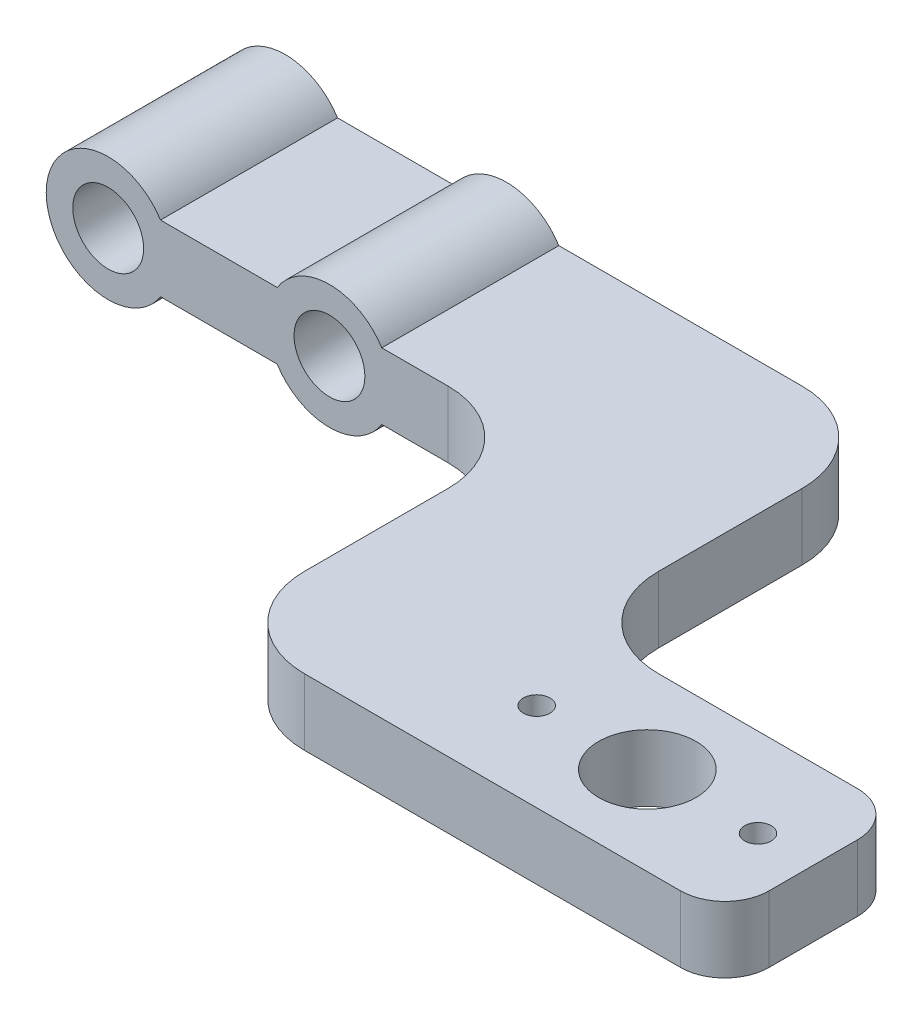
ISO-10303-21;
HEADER;
FILE_DESCRIPTION(('STEP AP214'),'2;1');
FILE_NAME('part.step','',(''),(''),'','','');
FILE_SCHEMA(('AUTOMOTIVE_DESIGN { 1 0 10303 214 1 1 1 1 }'));
ENDSEC;
DATA;
#1=APPLICATION_CONTEXT('core data for automotive mechanical design processes');
#2=APPLICATION_PROTOCOL_DEFINITION('international standard','automotive_design',2000,#1);
#3=PRODUCT_CONTEXT('',#1,'mechanical');
#4=PRODUCT('Part','Part','',(#3));
#5=PRODUCT_RELATED_PRODUCT_CATEGORY('part','',(#4));
#6=PRODUCT_DEFINITION_FORMATION('','',#4);
#7=PRODUCT_DEFINITION_CONTEXT('part definition',#1,'design');
#8=PRODUCT_DEFINITION('design','',#6,#7);
#9=PRODUCT_DEFINITION_SHAPE('','',#8);
#10=(LENGTH_UNIT() NAMED_UNIT(*) SI_UNIT(.MILLI.,.METRE.));
#11=(NAMED_UNIT(*) PLANE_ANGLE_UNIT() SI_UNIT($,.RADIAN.));
#12=(NAMED_UNIT(*) SI_UNIT($,.STERADIAN.) SOLID_ANGLE_UNIT());
#13=UNCERTAINTY_MEASURE_WITH_UNIT(LENGTH_MEASURE(1.E-05),#10,'distance_accuracy_value','');
#14=(GEOMETRIC_REPRESENTATION_CONTEXT(3) GLOBAL_UNCERTAINTY_ASSIGNED_CONTEXT((#13)) GLOBAL_UNIT_ASSIGNED_CONTEXT((#10,
#11,#12)) REPRESENTATION_CONTEXT('',''));
#15=CARTESIAN_POINT('',(0.,0.,0.));
#16=DIRECTION('',(0.,0.,1.));
#17=DIRECTION('',(1.,0.,0.));
#18=AXIS2_PLACEMENT_3D('',#15,#16,#17);
#19=CARTESIAN_POINT('',(-34.8643180835074,1.5,-18.5));
#20=DIRECTION('',(0.,0.,1.));
#21=DIRECTION('',(1.,0.,0.));
#22=AXIS2_PLACEMENT_3D('',#19,#20,#21);
#23=CYLINDRICAL_SURFACE('',#22,2.8);
#24=CARTESIAN_POINT('',(-34.8643180835074,1.5,-10.5));
#25=DIRECTION('',(0.,0.,-1.));
#26=DIRECTION('',(-1.,0.,0.));
#27=AXIS2_PLACEMENT_3D('',#24,#25,#26);
#28=CIRCLE('',#27,2.8);
#29=CARTESIAN_POINT('',(-32.5,2.99999999999999,-10.5));
#30=VERTEX_POINT('',#29);
#31=CARTESIAN_POINT('',(-32.5,0.,-10.5));
#32=VERTEX_POINT('',#31);
#33=EDGE_CURVE('E394',#30,#32,#28,.F.);
#34=ORIENTED_EDGE('',*,*,#33,.F.);
#35=DIRECTION('',(0.,0.,1.));
#36=VECTOR('',#35,1.);
#37=CARTESIAN_POINT('',(-32.5,2.99999999999999,-18.5));
#38=LINE('',#37,#36);
#39=CARTESIAN_POINT('',(-32.5,2.99999999999999,-18.5));
#40=VERTEX_POINT('',#39);
#41=EDGE_CURVE('E187',#40,#30,#38,.T.);
#42=ORIENTED_EDGE('',*,*,#41,.F.);
#43=CARTESIAN_POINT('',(-34.8643180835074,1.5,-18.5));
#44=DIRECTION('',(0.,0.,1.));
#45=DIRECTION('',(1.,0.,0.));
#46=AXIS2_PLACEMENT_3D('',#43,#44,#45);
#47=CIRCLE('',#46,2.8);
#48=CARTESIAN_POINT('',(-32.5,0.,-18.5));
#49=VERTEX_POINT('',#48);
#50=EDGE_CURVE('E353',#40,#49,#47,.T.);
#51=ORIENTED_EDGE('',*,*,#50,.T.);
#52=DIRECTION('',(0.,0.,1.));
#53=VECTOR('',#52,1.);
#54=CARTESIAN_POINT('',(-32.5,0.,-18.5));
#55=LINE('',#54,#53);
#56=EDGE_CURVE('E199',#49,#32,#55,.T.);
#57=ORIENTED_EDGE('',*,*,#56,.T.);
#58=EDGE_LOOP('',(#34,#42,#51,#57));
#59=FACE_BOUND('',#58,.T.);
#60=ADVANCED_FACE('F39',(#59),#23,.T.);
#61=CARTESIAN_POINT('',(0.,3.,0.));
#62=DIRECTION('',(0.,-1.,0.));
#63=DIRECTION('',(0.,0.,-1.));
#64=AXIS2_PLACEMENT_3D('',#61,#62,#63);
#65=PLANE('',#64);
#66=DIRECTION('',(0.,0.,1.));
#67=VECTOR('',#66,1.);
#68=CARTESIAN_POINT('',(-7.5,3.,-18.5));
#69=LINE('',#68,#67);
#70=CARTESIAN_POINT('',(-7.5,3.,-14.5));
#71=VERTEX_POINT('',#70);
#72=CARTESIAN_POINT('',(-7.5,3.,-8.));
#73=VERTEX_POINT('',#72);
#74=EDGE_CURVE('E201',#71,#73,#69,.T.);
#75=ORIENTED_EDGE('',*,*,#74,.F.);
#76=CARTESIAN_POINT('',(-11.5,3.,-14.5));
#77=DIRECTION('',(0.,-1.,0.));
#78=DIRECTION('',(0.,0.,-1.));
#79=AXIS2_PLACEMENT_3D('',#76,#77,#78);
#80=CIRCLE('',#79,4.);
#81=CARTESIAN_POINT('',(-11.5,3.,-18.5));
#82=VERTEX_POINT('',#81);
#83=EDGE_CURVE('E311',#71,#82,#80,.F.);
#84=ORIENTED_EDGE('',*,*,#83,.T.);
#85=DIRECTION('',(-1.,0.,0.));
#86=VECTOR('',#85,1.);
#87=CARTESIAN_POINT('',(-7.5,3.,-18.5));
#88=LINE('',#87,#86);
#89=CARTESIAN_POINT('',(-22.5,3.,-18.5));
#90=VERTEX_POINT('',#89);
#91=EDGE_CURVE('E361',#82,#90,#88,.T.);
#92=ORIENTED_EDGE('',*,*,#91,.T.);
#93=DIRECTION('',(0.,0.,1.));
#94=VECTOR('',#93,1.);
#95=CARTESIAN_POINT('',(-22.5,3.,-18.5));
#96=LINE('',#95,#94);
#97=CARTESIAN_POINT('',(-22.5,3.,-10.5));
#98=VERTEX_POINT('',#97);
#99=EDGE_CURVE('E195',#90,#98,#96,.T.);
#100=ORIENTED_EDGE('',*,*,#99,.T.);
#101=DIRECTION('',(1.,0.,0.));
#102=VECTOR('',#101,1.);
#103=CARTESIAN_POINT('',(0.,3.,-10.5));
#104=LINE('',#103,#102);
#105=CARTESIAN_POINT('',(-19.5,3.,-10.5));
#106=VERTEX_POINT('',#105);
#107=EDGE_CURVE('E174',#98,#106,#104,.T.);
#108=ORIENTED_EDGE('',*,*,#107,.T.);
#109=CARTESIAN_POINT('',(-19.5,3.,-6.5));
#110=DIRECTION('',(0.,-1.,0.));
#111=DIRECTION('',(0.,0.,-1.));
#112=AXIS2_PLACEMENT_3D('',#109,#110,#111);
#113=CIRCLE('',#112,4.);
#114=CARTESIAN_POINT('',(-15.5,3.,-6.5));
#115=VERTEX_POINT('',#114);
#116=EDGE_CURVE('E328',#106,#115,#113,.T.);
#117=ORIENTED_EDGE('',*,*,#116,.T.);
#118=DIRECTION('',(0.,0.,1.));
#119=VECTOR('',#118,1.);
#120=CARTESIAN_POINT('',(-15.5,3.,0.));
#121=LINE('',#120,#119);
#122=CARTESIAN_POINT('',(-15.5,3.,0.));
#123=VERTEX_POINT('',#122);
#124=EDGE_CURVE('E376',#115,#123,#121,.T.);
#125=ORIENTED_EDGE('',*,*,#124,.T.);
#126=CARTESIAN_POINT('',(-11.5,3.,0.));
#127=DIRECTION('',(0.,-1.,0.));
#128=DIRECTION('',(0.,0.,-1.));
#129=AXIS2_PLACEMENT_3D('',#126,#127,#128);
#130=CIRCLE('',#129,4.);
#131=CARTESIAN_POINT('',(-11.5,3.,4.));
#132=VERTEX_POINT('',#131);
#133=EDGE_CURVE('E308',#123,#132,#130,.F.);
#134=ORIENTED_EDGE('',*,*,#133,.T.);
#135=DIRECTION('',(1.,0.,0.));
#136=VECTOR('',#135,1.);
#137=CARTESIAN_POINT('',(-7.5,3.,4.));
#138=LINE('',#137,#136);
#139=CARTESIAN_POINT('',(5.5,3.,4.));
#140=VERTEX_POINT('',#139);
#141=EDGE_CURVE('E247',#132,#140,#138,.T.);
#142=ORIENTED_EDGE('',*,*,#141,.T.);
#143=CARTESIAN_POINT('',(5.5,3.,2.));
#144=DIRECTION('',(0.,-1.,0.));
#145=DIRECTION('',(0.,0.,-1.));
#146=AXIS2_PLACEMENT_3D('',#143,#144,#145);
#147=CIRCLE('',#146,2.);
#148=CARTESIAN_POINT('',(7.5,3.,2.));
#149=VERTEX_POINT('',#148);
#150=EDGE_CURVE('E276',#140,#149,#147,.F.);
#151=ORIENTED_EDGE('',*,*,#150,.T.);
#152=DIRECTION('',(0.,0.,-1.));
#153=VECTOR('',#152,1.);
#154=CARTESIAN_POINT('',(7.5,3.,4.));
#155=LINE('',#154,#153);
#156=CARTESIAN_POINT('',(7.5,3.,-2.));
#157=VERTEX_POINT('',#156);
#158=EDGE_CURVE('E238',#149,#157,#155,.T.);
#159=ORIENTED_EDGE('',*,*,#158,.T.);
#160=CARTESIAN_POINT('',(5.5,3.,-2.));
#161=DIRECTION('',(0.,-1.,0.));
#162=DIRECTION('',(0.,0.,-1.));
#163=AXIS2_PLACEMENT_3D('',#160,#161,#162);
#164=CIRCLE('',#163,2.);
#165=CARTESIAN_POINT('',(5.5,3.,-4.));
#166=VERTEX_POINT('',#165);
#167=EDGE_CURVE('E279',#157,#166,#164,.F.);
#168=ORIENTED_EDGE('',*,*,#167,.T.);
#169=DIRECTION('',(-1.,0.,0.));
#170=VECTOR('',#169,1.);
#171=CARTESIAN_POINT('',(-7.5,3.,-4.));
#172=LINE('',#171,#170);
#173=CARTESIAN_POINT('',(-3.5,3.,-4.));
#174=VERTEX_POINT('',#173);
#175=EDGE_CURVE('E242',#166,#174,#172,.T.);
#176=ORIENTED_EDGE('',*,*,#175,.T.);
#177=CARTESIAN_POINT('',(-3.5,3.,-8.));
#178=DIRECTION('',(0.,-1.,0.));
#179=DIRECTION('',(0.,0.,-1.));
#180=AXIS2_PLACEMENT_3D('',#177,#178,#179);
#181=CIRCLE('',#180,4.);
#182=EDGE_CURVE('E11',#174,#73,#181,.T.);
#183=ORIENTED_EDGE('',*,*,#182,.T.);
#184=EDGE_LOOP('',(#75,#84,#92,#100,#108,#117,#125,#134,#142,#151,#159,#168,#176,#183));
#185=FACE_BOUND('',#184,.T.);
#186=CARTESIAN_POINT('',(0.,3.,0.));
#187=DIRECTION('',(0.,1.,0.));
#188=DIRECTION('',(0.,0.,1.));
#189=AXIS2_PLACEMENT_3D('',#186,#187,#188);
#190=CIRCLE('',#189,2.2);
#191=CARTESIAN_POINT('',(0.,3.,2.2));
#192=VERTEX_POINT('',#191);
#193=EDGE_CURVE('E230',#192,#192,#190,.T.);
#194=ORIENTED_EDGE('',*,*,#193,.F.);
#195=EDGE_LOOP('',(#194));
#196=FACE_BOUND('',#195,.T.);
#197=CARTESIAN_POINT('',(-5.,3.,0.));
#198=DIRECTION('',(0.,1.,0.));
#199=DIRECTION('',(0.,0.,1.));
#200=AXIS2_PLACEMENT_3D('',#197,#198,#199);
#201=CIRCLE('',#200,0.6);
#202=CARTESIAN_POINT('',(-5.,3.,0.600000000000002));
#203=VERTEX_POINT('',#202);
#204=EDGE_CURVE('E222',#203,#203,#201,.T.);
#205=ORIENTED_EDGE('',*,*,#204,.F.);
#206=EDGE_LOOP('',(#205));
#207=FACE_BOUND('',#206,.T.);
#208=CARTESIAN_POINT('',(5.,3.,0.));
#209=DIRECTION('',(0.,1.,0.));
#210=DIRECTION('',(0.,0.,-1.));
#211=AXIS2_PLACEMENT_3D('',#208,#209,#210);
#212=CIRCLE('',#211,0.6);
#213=CARTESIAN_POINT('',(5.,3.,-0.599999999999998));
#214=VERTEX_POINT('',#213);
#215=EDGE_CURVE('E212',#214,#214,#212,.T.);
#216=ORIENTED_EDGE('',*,*,#215,.F.);
#217=EDGE_LOOP('',(#216));
#218=FACE_BOUND('',#217,.T.);
#219=ADVANCED_FACE('F421',(#185,#196,#207,#218),#65,.F.);
#220=CARTESIAN_POINT('',(0.,0.,0.));
#221=DIRECTION('',(0.,-1.,0.));
#222=DIRECTION('',(0.,0.,-1.));
#223=AXIS2_PLACEMENT_3D('',#220,#221,#222);
#224=PLANE('',#223);
#225=DIRECTION('',(1.,0.,0.));
#226=VECTOR('',#225,1.);
#227=CARTESIAN_POINT('',(-7.5,0.,-18.5));
#228=LINE('',#227,#226);
#229=CARTESIAN_POINT('',(-22.5,0.,-18.5));
#230=VERTEX_POINT('',#229);
#231=CARTESIAN_POINT('',(-11.5,0.,-18.5));
#232=VERTEX_POINT('',#231);
#233=EDGE_CURVE('E364',#230,#232,#228,.T.);
#234=ORIENTED_EDGE('',*,*,#233,.T.);
#235=CARTESIAN_POINT('',(-11.5,0.,-14.5));
#236=DIRECTION('',(0.,-1.,0.));
#237=DIRECTION('',(0.,0.,-1.));
#238=AXIS2_PLACEMENT_3D('',#235,#236,#237);
#239=CIRCLE('',#238,4.);
#240=CARTESIAN_POINT('',(-7.5,0.,-14.5));
#241=VERTEX_POINT('',#240);
#242=EDGE_CURVE('E320',#232,#241,#239,.T.);
#243=ORIENTED_EDGE('',*,*,#242,.T.);
#244=DIRECTION('',(0.,0.,1.));
#245=VECTOR('',#244,1.);
#246=CARTESIAN_POINT('',(-7.5,0.,-18.5));
#247=LINE('',#246,#245);
#248=CARTESIAN_POINT('',(-7.5,0.,-8.));
#249=VERTEX_POINT('',#248);
#250=EDGE_CURVE('E208',#241,#249,#247,.T.);
#251=ORIENTED_EDGE('',*,*,#250,.T.);
#252=CARTESIAN_POINT('',(-3.5,0.,-8.));
#253=DIRECTION('',(0.,-1.,0.));
#254=DIRECTION('',(0.,0.,-1.));
#255=AXIS2_PLACEMENT_3D('',#252,#253,#254);
#256=CIRCLE('',#255,4.);
#257=CARTESIAN_POINT('',(-3.5,0.,-4.));
#258=VERTEX_POINT('',#257);
#259=EDGE_CURVE('E48',#249,#258,#256,.F.);
#260=ORIENTED_EDGE('',*,*,#259,.T.);
#261=DIRECTION('',(-1.,0.,0.));
#262=VECTOR('',#261,1.);
#263=CARTESIAN_POINT('',(-7.5,0.,-4.));
#264=LINE('',#263,#262);
#265=CARTESIAN_POINT('',(5.5,0.,-4.));
#266=VERTEX_POINT('',#265);
#267=EDGE_CURVE('E254',#266,#258,#264,.T.);
#268=ORIENTED_EDGE('',*,*,#267,.F.);
#269=CARTESIAN_POINT('',(5.5,0.,-2.));
#270=DIRECTION('',(0.,-1.,0.));
#271=DIRECTION('',(0.,0.,-1.));
#272=AXIS2_PLACEMENT_3D('',#269,#270,#271);
#273=CIRCLE('',#272,2.);
#274=CARTESIAN_POINT('',(7.5,0.,-2.));
#275=VERTEX_POINT('',#274);
#276=EDGE_CURVE('E266',#266,#275,#273,.T.);
#277=ORIENTED_EDGE('',*,*,#276,.T.);
#278=DIRECTION('',(0.,0.,-1.));
#279=VECTOR('',#278,1.);
#280=CARTESIAN_POINT('',(7.5,0.,4.));
#281=LINE('',#280,#279);
#282=CARTESIAN_POINT('',(7.5,0.,2.));
#283=VERTEX_POINT('',#282);
#284=EDGE_CURVE('E234',#283,#275,#281,.T.);
#285=ORIENTED_EDGE('',*,*,#284,.F.);
#286=CARTESIAN_POINT('',(5.5,0.,2.));
#287=DIRECTION('',(0.,-1.,0.));
#288=DIRECTION('',(0.,0.,-1.));
#289=AXIS2_PLACEMENT_3D('',#286,#287,#288);
#290=CIRCLE('',#289,2.);
#291=CARTESIAN_POINT('',(5.5,0.,4.));
#292=VERTEX_POINT('',#291);
#293=EDGE_CURVE('E262',#283,#292,#290,.T.);
#294=ORIENTED_EDGE('',*,*,#293,.T.);
#295=DIRECTION('',(1.,0.,0.));
#296=VECTOR('',#295,1.);
#297=CARTESIAN_POINT('',(-7.5,0.,4.));
#298=LINE('',#297,#296);
#299=CARTESIAN_POINT('',(-11.5,0.,4.));
#300=VERTEX_POINT('',#299);
#301=EDGE_CURVE('E243',#300,#292,#298,.T.);
#302=ORIENTED_EDGE('',*,*,#301,.F.);
#303=CARTESIAN_POINT('',(-11.5,0.,0.));
#304=DIRECTION('',(0.,-1.,0.));
#305=DIRECTION('',(0.,0.,-1.));
#306=AXIS2_PLACEMENT_3D('',#303,#304,#305);
#307=CIRCLE('',#306,4.);
#308=CARTESIAN_POINT('',(-15.5,0.,0.));
#309=VERTEX_POINT('',#308);
#310=EDGE_CURVE('E317',#300,#309,#307,.T.);
#311=ORIENTED_EDGE('',*,*,#310,.T.);
#312=DIRECTION('',(0.,0.,1.));
#313=VECTOR('',#312,1.);
#314=CARTESIAN_POINT('',(-15.5,0.,0.));
#315=LINE('',#314,#313);
#316=CARTESIAN_POINT('',(-15.5,0.,-6.5));
#317=VERTEX_POINT('',#316);
#318=EDGE_CURVE('E380',#317,#309,#315,.T.);
#319=ORIENTED_EDGE('',*,*,#318,.F.);
#320=CARTESIAN_POINT('',(-19.5,0.,-6.5));
#321=DIRECTION('',(0.,-1.,0.));
#322=DIRECTION('',(0.,0.,-1.));
#323=AXIS2_PLACEMENT_3D('',#320,#321,#322);
#324=CIRCLE('',#323,4.);
#325=CARTESIAN_POINT('',(-19.5,0.,-10.5));
#326=VERTEX_POINT('',#325);
#327=EDGE_CURVE('E331',#317,#326,#324,.F.);
#328=ORIENTED_EDGE('',*,*,#327,.T.);
#329=DIRECTION('',(1.,0.,0.));
#330=VECTOR('',#329,1.);
#331=CARTESIAN_POINT('',(0.,0.,-10.5));
#332=LINE('',#331,#330);
#333=CARTESIAN_POINT('',(-22.5,0.,-10.5));
#334=VERTEX_POINT('',#333);
#335=EDGE_CURVE('E384',#334,#326,#332,.T.);
#336=ORIENTED_EDGE('',*,*,#335,.F.);
#337=DIRECTION('',(0.,0.,1.));
#338=VECTOR('',#337,1.);
#339=CARTESIAN_POINT('',(-22.5,0.,-18.5));
#340=LINE('',#339,#338);
#341=EDGE_CURVE('E221',#230,#334,#340,.T.);
#342=ORIENTED_EDGE('',*,*,#341,.F.);
#343=EDGE_LOOP('',(#234,#243,#251,#260,#268,#277,#285,#294,#302,#311,#319,#328,#336,#342));
#344=FACE_BOUND('',#343,.T.);
#345=CARTESIAN_POINT('',(-5.,0.,0.));
#346=DIRECTION('',(0.,1.,0.));
#347=DIRECTION('',(0.,0.,1.));
#348=AXIS2_PLACEMENT_3D('',#345,#346,#347);
#349=CIRCLE('',#348,0.6);
#350=CARTESIAN_POINT('',(-5.,0.,0.600000000000002));
#351=VERTEX_POINT('',#350);
#352=EDGE_CURVE('E216',#351,#351,#349,.T.);
#353=ORIENTED_EDGE('',*,*,#352,.T.);
#354=EDGE_LOOP('',(#353));
#355=FACE_BOUND('',#354,.T.);
#356=CARTESIAN_POINT('',(0.,0.,0.));
#357=DIRECTION('',(0.,1.,0.));
#358=DIRECTION('',(0.,0.,1.));
#359=AXIS2_PLACEMENT_3D('',#356,#357,#358);
#360=CIRCLE('',#359,2.2);
#361=CARTESIAN_POINT('',(0.,0.,2.2));
#362=VERTEX_POINT('',#361);
#363=EDGE_CURVE('E226',#362,#362,#360,.T.);
#364=ORIENTED_EDGE('',*,*,#363,.T.);
#365=EDGE_LOOP('',(#364));
#366=FACE_BOUND('',#365,.T.);
#367=CARTESIAN_POINT('',(5.,0.,0.));
#368=DIRECTION('',(0.,1.,0.));
#369=DIRECTION('',(0.,0.,-1.));
#370=AXIS2_PLACEMENT_3D('',#367,#368,#369);
#371=CIRCLE('',#370,0.6);
#372=CARTESIAN_POINT('',(5.,0.,-0.599999999999998));
#373=VERTEX_POINT('',#372);
#374=EDGE_CURVE('E217',#373,#373,#371,.T.);
#375=ORIENTED_EDGE('',*,*,#374,.T.);
#376=EDGE_LOOP('',(#375));
#377=FACE_BOUND('',#376,.T.);
#378=ADVANCED_FACE('F426',(#344,#355,#366,#377),#224,.T.);
#379=CARTESIAN_POINT('',(7.5,3.,4.));
#380=DIRECTION('',(-1.,0.,0.));
#381=DIRECTION('',(0.,0.,1.));
#382=AXIS2_PLACEMENT_3D('',#379,#380,#381);
#383=PLANE('',#382);
#384=ORIENTED_EDGE('',*,*,#284,.T.);
#385=DIRECTION('',(0.,-1.,0.));
#386=VECTOR('',#385,1.);
#387=CARTESIAN_POINT('',(7.5,3.,-2.));
#388=LINE('',#387,#386);
#389=EDGE_CURVE('E273',#275,#157,#388,.F.);
#390=ORIENTED_EDGE('',*,*,#389,.T.);
#391=ORIENTED_EDGE('',*,*,#158,.F.);
#392=DIRECTION('',(0.,-1.,0.));
#393=VECTOR('',#392,1.);
#394=CARTESIAN_POINT('',(7.5,3.,2.));
#395=LINE('',#394,#393);
#396=EDGE_CURVE('E269',#149,#283,#395,.T.);
#397=ORIENTED_EDGE('',*,*,#396,.T.);
#398=EDGE_LOOP('',(#384,#390,#391,#397));
#399=FACE_BOUND('',#398,.T.);
#400=ADVANCED_FACE('F458',(#399),#383,.F.);
#401=CARTESIAN_POINT('',(-7.5,3.,-4.));
#402=DIRECTION('',(0.,0.,1.));
#403=DIRECTION('',(1.,0.,0.));
#404=AXIS2_PLACEMENT_3D('',#401,#402,#403);
#405=PLANE('',#404);
#406=ORIENTED_EDGE('',*,*,#267,.T.);
#407=DIRECTION('',(0.,-1.,0.));
#408=VECTOR('',#407,1.);
#409=CARTESIAN_POINT('',(-3.5,3.,-4.));
#410=LINE('',#409,#408);
#411=EDGE_CURVE('E323',#258,#174,#410,.F.);
#412=ORIENTED_EDGE('',*,*,#411,.T.);
#413=ORIENTED_EDGE('',*,*,#175,.F.);
#414=DIRECTION('',(0.,-1.,0.));
#415=VECTOR('',#414,1.);
#416=CARTESIAN_POINT('',(5.5,3.,-4.));
#417=LINE('',#416,#415);
#418=EDGE_CURVE('E250',#166,#266,#417,.T.);
#419=ORIENTED_EDGE('',*,*,#418,.T.);
#420=EDGE_LOOP('',(#406,#412,#413,#419));
#421=FACE_BOUND('',#420,.T.);
#422=ADVANCED_FACE('F461',(#421),#405,.F.);
#423=CARTESIAN_POINT('',(-7.5,3.,4.));
#424=DIRECTION('',(0.,0.,-1.));
#425=DIRECTION('',(-1.,0.,0.));
#426=AXIS2_PLACEMENT_3D('',#423,#424,#425);
#427=PLANE('',#426);
#428=ORIENTED_EDGE('',*,*,#141,.F.);
#429=DIRECTION('',(0.,1.,0.));
#430=VECTOR('',#429,1.);
#431=CARTESIAN_POINT('',(-11.5,3.,4.));
#432=LINE('',#431,#430);
#433=EDGE_CURVE('E55',#132,#300,#432,.F.);
#434=ORIENTED_EDGE('',*,*,#433,.T.);
#435=ORIENTED_EDGE('',*,*,#301,.T.);
#436=DIRECTION('',(0.,-1.,0.));
#437=VECTOR('',#436,1.);
#438=CARTESIAN_POINT('',(5.5,3.,4.));
#439=LINE('',#438,#437);
#440=EDGE_CURVE('E282',#292,#140,#439,.F.);
#441=ORIENTED_EDGE('',*,*,#440,.T.);
#442=EDGE_LOOP('',(#428,#434,#435,#441));
#443=FACE_BOUND('',#442,.T.);
#444=ADVANCED_FACE('F453',(#443),#427,.F.);
#445=CARTESIAN_POINT('',(0.,3.,0.));
#446=DIRECTION('',(0.,-1.,0.));
#447=DIRECTION('',(0.,0.,-1.));
#448=AXIS2_PLACEMENT_3D('',#445,#446,#447);
#449=CYLINDRICAL_SURFACE('',#448,2.2);
#450=ORIENTED_EDGE('',*,*,#193,.T.);
#451=EDGE_LOOP('',(#450));
#452=FACE_BOUND('',#451,.T.);
#453=ORIENTED_EDGE('',*,*,#363,.F.);
#454=EDGE_LOOP('',(#453));
#455=FACE_BOUND('',#454,.T.);
#456=ADVANCED_FACE('F450',(#452,#455),#449,.F.);
#457=CARTESIAN_POINT('',(-5.,3.,0.));
#458=DIRECTION('',(0.,-1.,0.));
#459=DIRECTION('',(0.,0.,-1.));
#460=AXIS2_PLACEMENT_3D('',#457,#458,#459);
#461=CYLINDRICAL_SURFACE('',#460,0.6);
#462=ORIENTED_EDGE('',*,*,#204,.T.);
#463=EDGE_LOOP('',(#462));
#464=FACE_BOUND('',#463,.T.);
#465=ORIENTED_EDGE('',*,*,#352,.F.);
#466=EDGE_LOOP('',(#465));
#467=FACE_BOUND('',#466,.T.);
#468=ADVANCED_FACE('F446',(#464,#467),#461,.F.);
#469=CARTESIAN_POINT('',(5.,3.,0.));
#470=DIRECTION('',(0.,-1.,0.));
#471=DIRECTION('',(0.,0.,-1.));
#472=AXIS2_PLACEMENT_3D('',#469,#470,#471);
#473=CYLINDRICAL_SURFACE('',#472,0.6);
#474=ORIENTED_EDGE('',*,*,#215,.T.);
#475=EDGE_LOOP('',(#474));
#476=FACE_BOUND('',#475,.T.);
#477=ORIENTED_EDGE('',*,*,#374,.F.);
#478=EDGE_LOOP('',(#477));
#479=FACE_BOUND('',#478,.T.);
#480=ADVANCED_FACE('F442',(#476,#479),#473,.F.);
#481=CARTESIAN_POINT('',(5.5,3.,-2.));
#482=DIRECTION('',(0.,-1.,0.));
#483=DIRECTION('',(0.,0.,-1.));
#484=AXIS2_PLACEMENT_3D('',#481,#482,#483);
#485=CYLINDRICAL_SURFACE('',#484,2.);
#486=ORIENTED_EDGE('',*,*,#167,.F.);
#487=ORIENTED_EDGE('',*,*,#389,.F.);
#488=ORIENTED_EDGE('',*,*,#276,.F.);
#489=ORIENTED_EDGE('',*,*,#418,.F.);
#490=EDGE_LOOP('',(#486,#487,#488,#489));
#491=FACE_BOUND('',#490,.T.);
#492=ADVANCED_FACE('F445',(#491),#485,.T.);
#493=CARTESIAN_POINT('',(5.5,3.,2.));
#494=DIRECTION('',(0.,-1.,0.));
#495=DIRECTION('',(0.,0.,-1.));
#496=AXIS2_PLACEMENT_3D('',#493,#494,#495);
#497=CYLINDRICAL_SURFACE('',#496,2.);
#498=ORIENTED_EDGE('',*,*,#150,.F.);
#499=ORIENTED_EDGE('',*,*,#440,.F.);
#500=ORIENTED_EDGE('',*,*,#293,.F.);
#501=ORIENTED_EDGE('',*,*,#396,.F.);
#502=EDGE_LOOP('',(#498,#499,#500,#501));
#503=FACE_BOUND('',#502,.T.);
#504=ADVANCED_FACE('F470',(#503),#497,.T.);
#505=CARTESIAN_POINT('',(-24.8643180835074,1.5,-18.5));
#506=DIRECTION('',(0.,0.,1.));
#507=DIRECTION('',(1.,0.,0.));
#508=AXIS2_PLACEMENT_3D('',#505,#506,#507);
#509=CYLINDRICAL_SURFACE('',#508,2.8);
#510=CARTESIAN_POINT('',(-24.8643180835074,1.5,-10.5));
#511=DIRECTION('',(0.,0.,-1.));
#512=DIRECTION('',(-1.,0.,0.));
#513=AXIS2_PLACEMENT_3D('',#510,#511,#512);
#514=CIRCLE('',#513,2.8);
#515=CARTESIAN_POINT('',(-27.2286361670148,0.,-10.5));
#516=VERTEX_POINT('',#515);
#517=EDGE_CURVE('E387',#516,#334,#514,.F.);
#518=ORIENTED_EDGE('',*,*,#517,.F.);
#519=DIRECTION('',(0.,0.,1.));
#520=VECTOR('',#519,1.);
#521=CARTESIAN_POINT('',(-27.2286361670148,0.,-18.5));
#522=LINE('',#521,#520);
#523=CARTESIAN_POINT('',(-27.2286361670148,0.,-18.5));
#524=VERTEX_POINT('',#523);
#525=EDGE_CURVE('E337',#524,#516,#522,.T.);
#526=ORIENTED_EDGE('',*,*,#525,.F.);
#527=CARTESIAN_POINT('',(-24.8643180835074,1.5,-18.5));
#528=DIRECTION('',(0.,0.,1.));
#529=DIRECTION('',(1.,0.,0.));
#530=AXIS2_PLACEMENT_3D('',#527,#528,#529);
#531=CIRCLE('',#530,2.8);
#532=EDGE_CURVE('E211',#524,#230,#531,.T.);
#533=ORIENTED_EDGE('',*,*,#532,.T.);
#534=ORIENTED_EDGE('',*,*,#341,.T.);
#535=EDGE_LOOP('',(#518,#526,#533,#534));
#536=FACE_BOUND('',#535,.T.);
#537=ADVANCED_FACE('F473',(#536),#509,.T.);
#538=CARTESIAN_POINT('',(-27.2286361670148,0.,-18.5));
#539=DIRECTION('',(0.,-1.,0.));
#540=DIRECTION('',(1.,0.,0.));
#541=AXIS2_PLACEMENT_3D('',#538,#539,#540);
#542=PLANE('',#541);
#543=DIRECTION('',(1.,0.,0.));
#544=VECTOR('',#543,1.);
#545=CARTESIAN_POINT('',(-27.2286361670148,0.,-10.5));
#546=LINE('',#545,#544);
#547=EDGE_CURVE('E390',#32,#516,#546,.T.);
#548=ORIENTED_EDGE('',*,*,#547,.F.);
#549=ORIENTED_EDGE('',*,*,#56,.F.);
#550=DIRECTION('',(1.,0.,0.));
#551=VECTOR('',#550,1.);
#552=CARTESIAN_POINT('',(-27.2286361670148,0.,-18.5));
#553=LINE('',#552,#551);
#554=EDGE_CURVE('E349',#49,#524,#553,.T.);
#555=ORIENTED_EDGE('',*,*,#554,.T.);
#556=ORIENTED_EDGE('',*,*,#525,.T.);
#557=EDGE_LOOP('',(#548,#549,#555,#556));
#558=FACE_BOUND('',#557,.T.);
#559=ADVANCED_FACE('F431',(#558),#542,.T.);
#560=CARTESIAN_POINT('',(-27.2286361670148,3.,-18.5));
#561=DIRECTION('',(0.,1.,0.));
#562=DIRECTION('',(-1.,0.,0.));
#563=AXIS2_PLACEMENT_3D('',#560,#561,#562);
#564=PLANE('',#563);
#565=DIRECTION('',(-1.,0.,0.));
#566=VECTOR('',#565,1.);
#567=CARTESIAN_POINT('',(-27.2286361670148,3.,-10.5));
#568=LINE('',#567,#566);
#569=CARTESIAN_POINT('',(-27.2286361670148,3.,-10.5));
#570=VERTEX_POINT('',#569);
#571=EDGE_CURVE('E170',#570,#30,#568,.T.);
#572=ORIENTED_EDGE('',*,*,#571,.F.);
#573=DIRECTION('',(0.,0.,1.));
#574=VECTOR('',#573,1.);
#575=CARTESIAN_POINT('',(-27.2286361670148,3.,-18.5));
#576=LINE('',#575,#574);
#577=CARTESIAN_POINT('',(-27.2286361670148,3.,-18.5));
#578=VERTEX_POINT('',#577);
#579=EDGE_CURVE('E185',#578,#570,#576,.T.);
#580=ORIENTED_EDGE('',*,*,#579,.F.);
#581=DIRECTION('',(-1.,0.,0.));
#582=VECTOR('',#581,1.);
#583=CARTESIAN_POINT('',(-27.2286361670148,3.,-18.5));
#584=LINE('',#583,#582);
#585=EDGE_CURVE('E356',#578,#40,#584,.T.);
#586=ORIENTED_EDGE('',*,*,#585,.T.);
#587=ORIENTED_EDGE('',*,*,#41,.T.);
#588=EDGE_LOOP('',(#572,#580,#586,#587));
#589=FACE_BOUND('',#588,.T.);
#590=ADVANCED_FACE('F183',(#589),#564,.T.);
#591=CARTESIAN_POINT('',(-24.8643180835074,1.5,-18.5));
#592=DIRECTION('',(0.,0.,1.));
#593=DIRECTION('',(1.,0.,0.));
#594=AXIS2_PLACEMENT_3D('',#591,#592,#593);
#595=CYLINDRICAL_SURFACE('',#594,2.8);
#596=CARTESIAN_POINT('',(-24.8643180835074,1.5,-10.5));
#597=DIRECTION('',(0.,0.,-1.));
#598=DIRECTION('',(-1.,0.,0.));
#599=AXIS2_PLACEMENT_3D('',#596,#597,#598);
#600=CIRCLE('',#599,2.8);
#601=EDGE_CURVE('E165',#98,#570,#600,.F.);
#602=ORIENTED_EDGE('',*,*,#601,.F.);
#603=ORIENTED_EDGE('',*,*,#99,.F.);
#604=CARTESIAN_POINT('',(-24.8643180835074,1.5,-18.5));
#605=DIRECTION('',(0.,0.,1.));
#606=DIRECTION('',(1.,0.,0.));
#607=AXIS2_PLACEMENT_3D('',#604,#605,#606);
#608=CIRCLE('',#607,2.8);
#609=EDGE_CURVE('E193',#90,#578,#608,.T.);
#610=ORIENTED_EDGE('',*,*,#609,.T.);
#611=ORIENTED_EDGE('',*,*,#579,.T.);
#612=EDGE_LOOP('',(#602,#603,#610,#611));
#613=FACE_BOUND('',#612,.T.);
#614=ADVANCED_FACE('F191',(#613),#595,.T.);
#615=CARTESIAN_POINT('',(-7.5,0.,-18.5));
#616=DIRECTION('',(1.,0.,0.));
#617=DIRECTION('',(0.,0.,-1.));
#618=AXIS2_PLACEMENT_3D('',#615,#616,#617);
#619=PLANE('',#618);
#620=ORIENTED_EDGE('',*,*,#250,.F.);
#621=DIRECTION('',(0.,1.,0.));
#622=VECTOR('',#621,1.);
#623=CARTESIAN_POINT('',(-7.5,3.,-14.5));
#624=LINE('',#623,#622);
#625=EDGE_CURVE('E304',#241,#71,#624,.T.);
#626=ORIENTED_EDGE('',*,*,#625,.T.);
#627=ORIENTED_EDGE('',*,*,#74,.T.);
#628=DIRECTION('',(0.,-1.,0.));
#629=VECTOR('',#628,1.);
#630=CARTESIAN_POINT('',(-7.5,0.,-8.));
#631=LINE('',#630,#629);
#632=EDGE_CURVE('E300',#73,#249,#631,.T.);
#633=ORIENTED_EDGE('',*,*,#632,.T.);
#634=EDGE_LOOP('',(#620,#626,#627,#633));
#635=FACE_BOUND('',#634,.T.);
#636=ADVANCED_FACE('F437',(#635),#619,.T.);
#637=CARTESIAN_POINT('',(-24.8643180835074,1.5,-18.5));
#638=DIRECTION('',(0.,0.,1.));
#639=DIRECTION('',(1.,0.,0.));
#640=AXIS2_PLACEMENT_3D('',#637,#638,#639);
#641=PLANE('',#640);
#642=CARTESIAN_POINT('',(-34.8643180835074,1.5,-18.5));
#643=DIRECTION('',(0.,0.,1.));
#644=DIRECTION('',(1.,0.,0.));
#645=AXIS2_PLACEMENT_3D('',#642,#643,#644);
#646=CIRCLE('',#645,1.60000000000001);
#647=CARTESIAN_POINT('',(-33.2643180835074,1.5,-18.5));
#648=VERTEX_POINT('',#647);
#649=EDGE_CURVE('E372',#648,#648,#646,.T.);
#650=ORIENTED_EDGE('',*,*,#649,.T.);
#651=EDGE_LOOP('',(#650));
#652=FACE_BOUND('',#651,.T.);
#653=CARTESIAN_POINT('',(-24.8643180835074,1.5,-18.5));
#654=DIRECTION('',(0.,0.,1.));
#655=DIRECTION('',(1.,0.,0.));
#656=AXIS2_PLACEMENT_3D('',#653,#654,#655);
#657=CIRCLE('',#656,1.6);
#658=CARTESIAN_POINT('',(-23.2643180835074,1.5,-18.5));
#659=VERTEX_POINT('',#658);
#660=EDGE_CURVE('E368',#659,#659,#657,.T.);
#661=ORIENTED_EDGE('',*,*,#660,.T.);
#662=EDGE_LOOP('',(#661));
#663=FACE_BOUND('',#662,.T.);
#664=ORIENTED_EDGE('',*,*,#91,.F.);
#665=DIRECTION('',(0.,1.,0.));
#666=VECTOR('',#665,1.);
#667=CARTESIAN_POINT('',(-11.5,0.,-18.5));
#668=LINE('',#667,#666);
#669=EDGE_CURVE('E314',#82,#232,#668,.F.);
#670=ORIENTED_EDGE('',*,*,#669,.T.);
#671=ORIENTED_EDGE('',*,*,#233,.F.);
#672=ORIENTED_EDGE('',*,*,#532,.F.);
#673=ORIENTED_EDGE('',*,*,#554,.F.);
#674=ORIENTED_EDGE('',*,*,#50,.F.);
#675=ORIENTED_EDGE('',*,*,#585,.F.);
#676=ORIENTED_EDGE('',*,*,#609,.F.);
#677=EDGE_LOOP('',(#664,#670,#671,#672,#673,#674,#675,#676));
#678=FACE_BOUND('',#677,.T.);
#679=ADVANCED_FACE('F440',(#652,#663,#678),#641,.F.);
#680=CARTESIAN_POINT('',(-24.8643180835074,1.5,-18.5));
#681=DIRECTION('',(0.,0.,1.));
#682=DIRECTION('',(1.,0.,0.));
#683=AXIS2_PLACEMENT_3D('',#680,#681,#682);
#684=CYLINDRICAL_SURFACE('',#683,1.6);
#685=CARTESIAN_POINT('',(-24.8643180835074,1.5,-10.5));
#686=DIRECTION('',(0.,0.,-1.));
#687=DIRECTION('',(-1.,0.,0.));
#688=AXIS2_PLACEMENT_3D('',#685,#686,#687);
#689=CIRCLE('',#688,1.6);
#690=CARTESIAN_POINT('',(-23.2643180835074,1.5,-10.5));
#691=VERTEX_POINT('',#690);
#692=EDGE_CURVE('E180',#691,#691,#689,.F.);
#693=CARTESIAN_POINT('',(-23.2643180835074,1.5,-10.5));
#694=CARTESIAN_POINT('',(-23.2643180835074,1.5,-10.5833333333333));
#695=CARTESIAN_POINT('',(-23.2643180835074,1.5,-10.6666666666667));
#696=CARTESIAN_POINT('',(-23.2643180835074,1.5,-10.8333333333333));
#697=CARTESIAN_POINT('',(-23.2643180835074,1.5,-10.9166666666667));
#698=CARTESIAN_POINT('',(-23.2643180835074,1.5,-11.0833333333333));
#699=CARTESIAN_POINT('',(-23.2643180835074,1.5,-11.1666666666667));
#700=CARTESIAN_POINT('',(-23.2643180835074,1.5,-11.3333333333333));
#701=CARTESIAN_POINT('',(-23.2643180835074,1.5,-11.4166666666667));
#702=CARTESIAN_POINT('',(-23.2643180835074,1.5,-11.5833333333333));
#703=CARTESIAN_POINT('',(-23.2643180835074,1.5,-11.6666666666667));
#704=CARTESIAN_POINT('',(-23.2643180835074,1.5,-11.8333333333333));
#705=CARTESIAN_POINT('',(-23.2643180835074,1.5,-11.9166666666667));
#706=CARTESIAN_POINT('',(-23.2643180835074,1.5,-12.0833333333333));
#707=CARTESIAN_POINT('',(-23.2643180835074,1.5,-12.1666666666667));
#708=CARTESIAN_POINT('',(-23.2643180835074,1.5,-12.3333333333333));
#709=CARTESIAN_POINT('',(-23.2643180835074,1.5,-12.4166666666667));
#710=CARTESIAN_POINT('',(-23.2643180835074,1.5,-12.5833333333333));
#711=CARTESIAN_POINT('',(-23.2643180835074,1.5,-12.6666666666667));
#712=CARTESIAN_POINT('',(-23.2643180835074,1.5,-12.8333333333333));
#713=CARTESIAN_POINT('',(-23.2643180835074,1.5,-12.9166666666667));
#714=CARTESIAN_POINT('',(-23.2643180835074,1.5,-13.0833333333333));
#715=CARTESIAN_POINT('',(-23.2643180835074,1.5,-13.1666666666667));
#716=CARTESIAN_POINT('',(-23.2643180835074,1.5,-13.3333333333333));
#717=CARTESIAN_POINT('',(-23.2643180835074,1.5,-13.4166666666667));
#718=CARTESIAN_POINT('',(-23.2643180835074,1.5,-13.5833333333333));
#719=CARTESIAN_POINT('',(-23.2643180835074,1.5,-13.6666666666667));
#720=CARTESIAN_POINT('',(-23.2643180835074,1.5,-13.8333333333333));
#721=CARTESIAN_POINT('',(-23.2643180835074,1.5,-13.9166666666667));
#722=CARTESIAN_POINT('',(-23.2643180835074,1.5,-14.0833333333333));
#723=CARTESIAN_POINT('',(-23.2643180835074,1.5,-14.1666666666667));
#724=CARTESIAN_POINT('',(-23.2643180835074,1.5,-14.3333333333333));
#725=CARTESIAN_POINT('',(-23.2643180835074,1.5,-14.4166666666667));
#726=CARTESIAN_POINT('',(-23.2643180835074,1.5,-14.5833333333333));
#727=CARTESIAN_POINT('',(-23.2643180835074,1.5,-14.6666666666667));
#728=CARTESIAN_POINT('',(-23.2643180835074,1.5,-14.8333333333333));
#729=CARTESIAN_POINT('',(-23.2643180835074,1.5,-14.9166666666667));
#730=CARTESIAN_POINT('',(-23.2643180835074,1.5,-15.0833333333333));
#731=CARTESIAN_POINT('',(-23.2643180835074,1.5,-15.1666666666667));
#732=CARTESIAN_POINT('',(-23.2643180835074,1.5,-15.3333333333333));
#733=CARTESIAN_POINT('',(-23.2643180835074,1.5,-15.4166666666667));
#734=CARTESIAN_POINT('',(-23.2643180835074,1.5,-15.5833333333333));
#735=CARTESIAN_POINT('',(-23.2643180835074,1.5,-15.6666666666667));
#736=CARTESIAN_POINT('',(-23.2643180835074,1.5,-15.8333333333333));
#737=CARTESIAN_POINT('',(-23.2643180835074,1.5,-15.9166666666667));
#738=CARTESIAN_POINT('',(-23.2643180835074,1.5,-16.0833333333333));
#739=CARTESIAN_POINT('',(-23.2643180835074,1.5,-16.1666666666667));
#740=CARTESIAN_POINT('',(-23.2643180835074,1.5,-16.3333333333333));
#741=CARTESIAN_POINT('',(-23.2643180835074,1.5,-16.4166666666667));
#742=CARTESIAN_POINT('',(-23.2643180835074,1.5,-16.5833333333333));
#743=CARTESIAN_POINT('',(-23.2643180835074,1.5,-16.6666666666667));
#744=CARTESIAN_POINT('',(-23.2643180835074,1.5,-16.8333333333333));
#745=CARTESIAN_POINT('',(-23.2643180835074,1.5,-16.9166666666667));
#746=CARTESIAN_POINT('',(-23.2643180835074,1.5,-17.0833333333333));
#747=CARTESIAN_POINT('',(-23.2643180835074,1.5,-17.1666666666667));
#748=CARTESIAN_POINT('',(-23.2643180835074,1.5,-17.3333333333333));
#749=CARTESIAN_POINT('',(-23.2643180835074,1.5,-17.4166666666667));
#750=CARTESIAN_POINT('',(-23.2643180835074,1.5,-17.5833333333333));
#751=CARTESIAN_POINT('',(-23.2643180835074,1.5,-17.6666666666667));
#752=CARTESIAN_POINT('',(-23.2643180835074,1.5,-17.8333333333333));
#753=CARTESIAN_POINT('',(-23.2643180835074,1.5,-17.9166666666667));
#754=CARTESIAN_POINT('',(-23.2643180835074,1.5,-18.0833333333333));
#755=CARTESIAN_POINT('',(-23.2643180835074,1.5,-18.1666666666667));
#756=CARTESIAN_POINT('',(-23.2643180835074,1.5,-18.3333333333333));
#757=CARTESIAN_POINT('',(-23.2643180835074,1.5,-18.4166666666667));
#758=CARTESIAN_POINT('',(-23.2643180835074,1.5,-18.5));
#759=B_SPLINE_CURVE_WITH_KNOTS('',3,(#693,#694,#695,#696,#697,#698,#699,#700,#701,#702,#703,
#704,#705,#706,#707,#708,#709,#710,#711,#712,#713,#714,#715,#716,#717,#718,#719,#720,#721,#722,
#723,#724,#725,#726,#727,#728,#729,#730,#731,#732,#733,#734,#735,#736,#737,#738,#739,#740,#741,
#742,#743,#744,#745,#746,#747,#748,#749,#750,#751,#752,#753,#754,#755,#756,#757,#758),
.UNSPECIFIED.,.F.,.F.,(4,2,2,2,2,2,2,2,2,2,2,2,2,2,2,2,2,2,2,2,2,2,2,2,2,2,2,2,2,2,2,2,4),(0.,
0.249999999999999,0.499999999999999,0.749999999999999,0.999999999999999,1.25,1.5,1.75,2.,2.25,
2.5,2.75,3.,3.25,3.5,3.75,4.,4.25,4.5,4.75,5.,5.25,5.5,5.75,6.,6.25,6.5,6.75,7.,7.25,
7.50000000000001,7.75000000000001,8.),.UNSPECIFIED.);
#760=EDGE_CURVE('BSEAM403',#691,#659,#759,.T.);
#761=ORIENTED_EDGE('',*,*,#692,.T.);
#762=ORIENTED_EDGE('',*,*,#660,.F.);
#763=ORIENTED_EDGE('',*,*,#760,.T.);
#764=ORIENTED_EDGE('',*,*,#760,.F.);
#765=EDGE_LOOP('',(#761,#763,#762,#764));
#766=FACE_BOUND('',#765,.T.);
#767=ADVANCED_FACE('F403',(#766),#684,.F.);
#768=CARTESIAN_POINT('',(-34.8643180835074,1.5,-18.5));
#769=DIRECTION('',(0.,0.,1.));
#770=DIRECTION('',(1.,0.,0.));
#771=AXIS2_PLACEMENT_3D('',#768,#769,#770);
#772=CYLINDRICAL_SURFACE('',#771,1.60000000000001);
#773=CARTESIAN_POINT('',(-34.8643180835074,1.5,-10.5));
#774=DIRECTION('',(0.,0.,-1.));
#775=DIRECTION('',(-1.,0.,0.));
#776=AXIS2_PLACEMENT_3D('',#773,#774,#775);
#777=CIRCLE('',#776,1.60000000000001);
#778=CARTESIAN_POINT('',(-33.2643180835074,1.5,-10.5));
#779=VERTEX_POINT('',#778);
#780=EDGE_CURVE('E287',#779,#779,#777,.F.);
#781=CARTESIAN_POINT('',(-33.2643180835074,1.5,-10.5));
#782=CARTESIAN_POINT('',(-33.2643180835074,1.5,-10.5833333333333));
#783=CARTESIAN_POINT('',(-33.2643180835074,1.5,-10.6666666666667));
#784=CARTESIAN_POINT('',(-33.2643180835074,1.5,-10.8333333333333));
#785=CARTESIAN_POINT('',(-33.2643180835074,1.5,-10.9166666666667));
#786=CARTESIAN_POINT('',(-33.2643180835074,1.5,-11.0833333333333));
#787=CARTESIAN_POINT('',(-33.2643180835074,1.5,-11.1666666666667));
#788=CARTESIAN_POINT('',(-33.2643180835074,1.5,-11.3333333333333));
#789=CARTESIAN_POINT('',(-33.2643180835074,1.5,-11.4166666666667));
#790=CARTESIAN_POINT('',(-33.2643180835074,1.5,-11.5833333333333));
#791=CARTESIAN_POINT('',(-33.2643180835074,1.5,-11.6666666666667));
#792=CARTESIAN_POINT('',(-33.2643180835074,1.5,-11.8333333333333));
#793=CARTESIAN_POINT('',(-33.2643180835074,1.5,-11.9166666666667));
#794=CARTESIAN_POINT('',(-33.2643180835074,1.5,-12.0833333333333));
#795=CARTESIAN_POINT('',(-33.2643180835074,1.5,-12.1666666666667));
#796=CARTESIAN_POINT('',(-33.2643180835074,1.5,-12.3333333333333));
#797=CARTESIAN_POINT('',(-33.2643180835074,1.5,-12.4166666666667));
#798=CARTESIAN_POINT('',(-33.2643180835074,1.5,-12.5833333333333));
#799=CARTESIAN_POINT('',(-33.2643180835074,1.5,-12.6666666666667));
#800=CARTESIAN_POINT('',(-33.2643180835074,1.5,-12.8333333333333));
#801=CARTESIAN_POINT('',(-33.2643180835074,1.5,-12.9166666666667));
#802=CARTESIAN_POINT('',(-33.2643180835074,1.5,-13.0833333333333));
#803=CARTESIAN_POINT('',(-33.2643180835074,1.5,-13.1666666666667));
#804=CARTESIAN_POINT('',(-33.2643180835074,1.5,-13.3333333333333));
#805=CARTESIAN_POINT('',(-33.2643180835074,1.5,-13.4166666666667));
#806=CARTESIAN_POINT('',(-33.2643180835074,1.5,-13.5833333333333));
#807=CARTESIAN_POINT('',(-33.2643180835074,1.5,-13.6666666666667));
#808=CARTESIAN_POINT('',(-33.2643180835074,1.5,-13.8333333333333));
#809=CARTESIAN_POINT('',(-33.2643180835074,1.5,-13.9166666666667));
#810=CARTESIAN_POINT('',(-33.2643180835074,1.5,-14.0833333333333));
#811=CARTESIAN_POINT('',(-33.2643180835074,1.5,-14.1666666666667));
#812=CARTESIAN_POINT('',(-33.2643180835074,1.5,-14.3333333333333));
#813=CARTESIAN_POINT('',(-33.2643180835074,1.5,-14.4166666666667));
#814=CARTESIAN_POINT('',(-33.2643180835074,1.5,-14.5833333333333));
#815=CARTESIAN_POINT('',(-33.2643180835074,1.5,-14.6666666666667));
#816=CARTESIAN_POINT('',(-33.2643180835074,1.5,-14.8333333333333));
#817=CARTESIAN_POINT('',(-33.2643180835074,1.5,-14.9166666666667));
#818=CARTESIAN_POINT('',(-33.2643180835074,1.5,-15.0833333333333));
#819=CARTESIAN_POINT('',(-33.2643180835074,1.5,-15.1666666666667));
#820=CARTESIAN_POINT('',(-33.2643180835074,1.5,-15.3333333333333));
#821=CARTESIAN_POINT('',(-33.2643180835074,1.5,-15.4166666666667));
#822=CARTESIAN_POINT('',(-33.2643180835074,1.5,-15.5833333333333));
#823=CARTESIAN_POINT('',(-33.2643180835074,1.5,-15.6666666666667));
#824=CARTESIAN_POINT('',(-33.2643180835074,1.5,-15.8333333333333));
#825=CARTESIAN_POINT('',(-33.2643180835074,1.5,-15.9166666666667));
#826=CARTESIAN_POINT('',(-33.2643180835074,1.5,-16.0833333333333));
#827=CARTESIAN_POINT('',(-33.2643180835074,1.5,-16.1666666666667));
#828=CARTESIAN_POINT('',(-33.2643180835074,1.5,-16.3333333333333));
#829=CARTESIAN_POINT('',(-33.2643180835074,1.5,-16.4166666666667));
#830=CARTESIAN_POINT('',(-33.2643180835074,1.5,-16.5833333333333));
#831=CARTESIAN_POINT('',(-33.2643180835074,1.5,-16.6666666666667));
#832=CARTESIAN_POINT('',(-33.2643180835074,1.5,-16.8333333333333));
#833=CARTESIAN_POINT('',(-33.2643180835074,1.5,-16.9166666666667));
#834=CARTESIAN_POINT('',(-33.2643180835074,1.5,-17.0833333333333));
#835=CARTESIAN_POINT('',(-33.2643180835074,1.5,-17.1666666666667));
#836=CARTESIAN_POINT('',(-33.2643180835074,1.5,-17.3333333333333));
#837=CARTESIAN_POINT('',(-33.2643180835074,1.5,-17.4166666666667));
#838=CARTESIAN_POINT('',(-33.2643180835074,1.5,-17.5833333333333));
#839=CARTESIAN_POINT('',(-33.2643180835074,1.5,-17.6666666666667));
#840=CARTESIAN_POINT('',(-33.2643180835074,1.5,-17.8333333333333));
#841=CARTESIAN_POINT('',(-33.2643180835074,1.5,-17.9166666666667));
#842=CARTESIAN_POINT('',(-33.2643180835074,1.5,-18.0833333333333));
#843=CARTESIAN_POINT('',(-33.2643180835074,1.5,-18.1666666666667));
#844=CARTESIAN_POINT('',(-33.2643180835074,1.5,-18.3333333333333));
#845=CARTESIAN_POINT('',(-33.2643180835074,1.5,-18.4166666666667));
#846=CARTESIAN_POINT('',(-33.2643180835074,1.5,-18.5));
#847=B_SPLINE_CURVE_WITH_KNOTS('',3,(#781,#782,#783,#784,#785,#786,#787,#788,#789,#790,#791,
#792,#793,#794,#795,#796,#797,#798,#799,#800,#801,#802,#803,#804,#805,#806,#807,#808,#809,#810,
#811,#812,#813,#814,#815,#816,#817,#818,#819,#820,#821,#822,#823,#824,#825,#826,#827,#828,#829,
#830,#831,#832,#833,#834,#835,#836,#837,#838,#839,#840,#841,#842,#843,#844,#845,#846),
.UNSPECIFIED.,.F.,.F.,(4,2,2,2,2,2,2,2,2,2,2,2,2,2,2,2,2,2,2,2,2,2,2,2,2,2,2,2,2,2,2,2,4),(0.,
0.249999999999999,0.499999999999999,0.749999999999999,0.999999999999999,1.25,1.5,1.75,2.,2.25,
2.5,2.75,3.,3.25,3.5,3.75,4.,4.25,4.5,4.75,5.,5.25,5.5,5.75,6.,6.25,6.5,6.75,7.,7.25,
7.50000000000001,7.75000000000001,8.),.UNSPECIFIED.);
#848=EDGE_CURVE('BSEAM417',#779,#648,#847,.T.);
#849=ORIENTED_EDGE('',*,*,#780,.T.);
#850=ORIENTED_EDGE('',*,*,#649,.F.);
#851=ORIENTED_EDGE('',*,*,#848,.T.);
#852=ORIENTED_EDGE('',*,*,#848,.F.);
#853=EDGE_LOOP('',(#849,#851,#850,#852));
#854=FACE_BOUND('',#853,.T.);
#855=ADVANCED_FACE('F417',(#854),#772,.F.);
#856=CARTESIAN_POINT('',(-15.5,-1.3,-10.5));
#857=DIRECTION('',(1.,0.,0.));
#858=DIRECTION('',(0.,0.,-1.));
#859=AXIS2_PLACEMENT_3D('',#856,#857,#858);
#860=PLANE('',#859);
#861=ORIENTED_EDGE('',*,*,#124,.F.);
#862=DIRECTION('',(0.,1.,0.));
#863=VECTOR('',#862,1.);
#864=CARTESIAN_POINT('',(-15.5,0.,-6.5));
#865=LINE('',#864,#863);
#866=EDGE_CURVE('E297',#115,#317,#865,.F.);
#867=ORIENTED_EDGE('',*,*,#866,.T.);
#868=ORIENTED_EDGE('',*,*,#318,.T.);
#869=DIRECTION('',(0.,1.,0.));
#870=VECTOR('',#869,1.);
#871=CARTESIAN_POINT('',(-15.5,-1.3,0.));
#872=LINE('',#871,#870);
#873=EDGE_CURVE('E293',#309,#123,#872,.T.);
#874=ORIENTED_EDGE('',*,*,#873,.T.);
#875=EDGE_LOOP('',(#861,#867,#868,#874));
#876=FACE_BOUND('',#875,.T.);
#877=ADVANCED_FACE('F408',(#876),#860,.F.);
#878=CARTESIAN_POINT('',(-37.6643180835074,-1.3,-10.5));
#879=DIRECTION('',(0.,0.,-1.));
#880=DIRECTION('',(-1.,0.,0.));
#881=AXIS2_PLACEMENT_3D('',#878,#879,#880);
#882=PLANE('',#881);
#883=ORIENTED_EDGE('',*,*,#335,.T.);
#884=DIRECTION('',(0.,1.,0.));
#885=VECTOR('',#884,1.);
#886=CARTESIAN_POINT('',(-19.5,3.,-10.5));
#887=LINE('',#886,#885);
#888=EDGE_CURVE('E286',#326,#106,#887,.T.);
#889=ORIENTED_EDGE('',*,*,#888,.T.);
#890=ORIENTED_EDGE('',*,*,#107,.F.);
#891=ORIENTED_EDGE('',*,*,#601,.T.);
#892=ORIENTED_EDGE('',*,*,#571,.T.);
#893=ORIENTED_EDGE('',*,*,#33,.T.);
#894=ORIENTED_EDGE('',*,*,#547,.T.);
#895=ORIENTED_EDGE('',*,*,#517,.T.);
#896=EDGE_LOOP('',(#883,#889,#890,#891,#892,#893,#894,#895));
#897=FACE_BOUND('',#896,.T.);
#898=ORIENTED_EDGE('',*,*,#780,.F.);
#899=EDGE_LOOP('',(#898));
#900=FACE_BOUND('',#899,.T.);
#901=ORIENTED_EDGE('',*,*,#692,.F.);
#902=EDGE_LOOP('',(#901));
#903=FACE_BOUND('',#902,.T.);
#904=ADVANCED_FACE('F168',(#897,#900,#903),#882,.F.);
#905=CARTESIAN_POINT('',(-19.5,-1.3,-6.5));
#906=DIRECTION('',(0.,-1.,0.));
#907=DIRECTION('',(0.,0.,-1.));
#908=AXIS2_PLACEMENT_3D('',#905,#906,#907);
#909=CYLINDRICAL_SURFACE('',#908,4.);
#910=ORIENTED_EDGE('',*,*,#327,.F.);
#911=ORIENTED_EDGE('',*,*,#866,.F.);
#912=ORIENTED_EDGE('',*,*,#116,.F.);
#913=ORIENTED_EDGE('',*,*,#888,.F.);
#914=EDGE_LOOP('',(#910,#911,#912,#913));
#915=FACE_BOUND('',#914,.T.);
#916=ADVANCED_FACE('F407',(#915),#909,.F.);
#917=CARTESIAN_POINT('',(-11.5,0.,-14.5));
#918=DIRECTION('',(0.,-1.,0.));
#919=DIRECTION('',(0.,0.,-1.));
#920=AXIS2_PLACEMENT_3D('',#917,#918,#919);
#921=CYLINDRICAL_SURFACE('',#920,4.);
#922=ORIENTED_EDGE('',*,*,#242,.F.);
#923=ORIENTED_EDGE('',*,*,#669,.F.);
#924=ORIENTED_EDGE('',*,*,#83,.F.);
#925=ORIENTED_EDGE('',*,*,#625,.F.);
#926=EDGE_LOOP('',(#922,#923,#924,#925));
#927=FACE_BOUND('',#926,.T.);
#928=ADVANCED_FACE('F414',(#927),#921,.T.);
#929=CARTESIAN_POINT('',(-3.5,0.,-8.));
#930=DIRECTION('',(0.,-1.,0.));
#931=DIRECTION('',(0.,0.,-1.));
#932=AXIS2_PLACEMENT_3D('',#929,#930,#931);
#933=CYLINDRICAL_SURFACE('',#932,4.);
#934=ORIENTED_EDGE('',*,*,#182,.F.);
#935=ORIENTED_EDGE('',*,*,#411,.F.);
#936=ORIENTED_EDGE('',*,*,#259,.F.);
#937=ORIENTED_EDGE('',*,*,#632,.F.);
#938=EDGE_LOOP('',(#934,#935,#936,#937));
#939=FACE_BOUND('',#938,.T.);
#940=ADVANCED_FACE('F477',(#939),#933,.F.);
#941=CARTESIAN_POINT('',(-11.5,-1.3,0.));
#942=DIRECTION('',(0.,1.,0.));
#943=DIRECTION('',(0.,0.,1.));
#944=AXIS2_PLACEMENT_3D('',#941,#942,#943);
#945=CYLINDRICAL_SURFACE('',#944,4.);
#946=ORIENTED_EDGE('',*,*,#310,.F.);
#947=ORIENTED_EDGE('',*,*,#433,.F.);
#948=ORIENTED_EDGE('',*,*,#133,.F.);
#949=ORIENTED_EDGE('',*,*,#873,.F.);
#950=EDGE_LOOP('',(#946,#947,#948,#949));
#951=FACE_BOUND('',#950,.T.);
#952=ADVANCED_FACE('F41',(#951),#945,.T.);
#953=CLOSED_SHELL('',(#60,#219,#378,#400,#422,#444,#456,#468,#480,#492,#504,#537,#559,#590,#614,
#636,#679,#767,#855,#877,#904,#916,#928,#940,#952));
#954=MANIFOLD_SOLID_BREP('B2',#953);
#955=ADVANCED_BREP_SHAPE_REPRESENTATION('',(#18,#954),#14);
#956=SHAPE_DEFINITION_REPRESENTATION(#9,#955);
ENDSEC;
END-ISO-10303-21;
